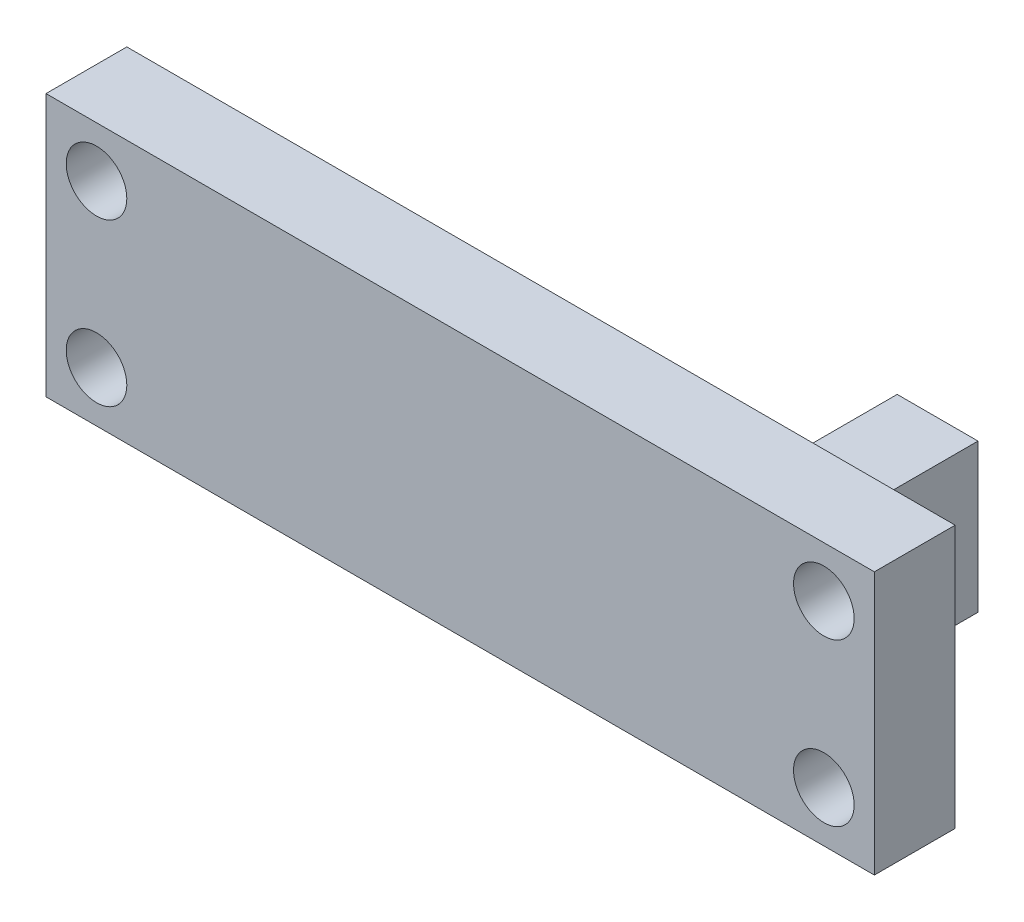
ISO-10303-21;
HEADER;
FILE_DESCRIPTION(('STEP AP214'),'2;1');
FILE_NAME('part.step','',(''),(''),'','','');
FILE_SCHEMA(('AUTOMOTIVE_DESIGN { 1 0 10303 214 1 1 1 1 }'));
ENDSEC;
DATA;
#1=APPLICATION_CONTEXT('core data for automotive mechanical design processes');
#2=APPLICATION_PROTOCOL_DEFINITION('international standard','automotive_design',2000,#1);
#3=PRODUCT_CONTEXT('',#1,'mechanical');
#4=PRODUCT('Part','Part','',(#3));
#5=PRODUCT_RELATED_PRODUCT_CATEGORY('part','',(#4));
#6=PRODUCT_DEFINITION_FORMATION('','',#4);
#7=PRODUCT_DEFINITION_CONTEXT('part definition',#1,'design');
#8=PRODUCT_DEFINITION('design','',#6,#7);
#9=PRODUCT_DEFINITION_SHAPE('','',#8);
#10=(LENGTH_UNIT() NAMED_UNIT(*) SI_UNIT(.MILLI.,.METRE.));
#11=(NAMED_UNIT(*) PLANE_ANGLE_UNIT() SI_UNIT($,.RADIAN.));
#12=(NAMED_UNIT(*) SI_UNIT($,.STERADIAN.) SOLID_ANGLE_UNIT());
#13=UNCERTAINTY_MEASURE_WITH_UNIT(LENGTH_MEASURE(1.E-05),#10,'distance_accuracy_value','');
#14=(GEOMETRIC_REPRESENTATION_CONTEXT(3) GLOBAL_UNCERTAINTY_ASSIGNED_CONTEXT((#13)) GLOBAL_UNIT_ASSIGNED_CONTEXT((#10,
#11,#12)) REPRESENTATION_CONTEXT('',''));
#15=CARTESIAN_POINT('',(0.,0.,0.));
#16=DIRECTION('',(0.,0.,1.));
#17=DIRECTION('',(1.,0.,0.));
#18=AXIS2_PLACEMENT_3D('',#15,#16,#17);
#19=CARTESIAN_POINT('',(0.,0.,0.));
#20=DIRECTION('',(0.,0.,1.));
#21=DIRECTION('',(1.,0.,0.));
#22=AXIS2_PLACEMENT_3D('',#19,#20,#21);
#23=PLANE('',#22);
#24=DIRECTION('',(0.,-1.,0.));
#25=VECTOR('',#24,1.);
#26=CARTESIAN_POINT('',(-41.,13.,0.));
#27=LINE('',#26,#25);
#28=CARTESIAN_POINT('',(-41.,13.,0.));
#29=VERTEX_POINT('',#28);
#30=CARTESIAN_POINT('',(-41.,0.,0.));
#31=VERTEX_POINT('',#30);
#32=EDGE_CURVE('E150',#29,#31,#27,.T.);
#33=ORIENTED_EDGE('',*,*,#32,.F.);
#34=DIRECTION('',(-1.,0.,0.));
#35=VECTOR('',#34,1.);
#36=CARTESIAN_POINT('',(-41.,13.,0.));
#37=LINE('',#36,#35);
#38=CARTESIAN_POINT('',(0.,13.,0.));
#39=VERTEX_POINT('',#38);
#40=EDGE_CURVE('E157',#39,#29,#37,.T.);
#41=ORIENTED_EDGE('',*,*,#40,.F.);
#42=DIRECTION('',(0.,1.,0.));
#43=VECTOR('',#42,1.);
#44=CARTESIAN_POINT('',(0.,13.,0.));
#45=LINE('',#44,#43);
#46=CARTESIAN_POINT('',(0.,0.,0.));
#47=VERTEX_POINT('',#46);
#48=EDGE_CURVE('E168',#47,#39,#45,.T.);
#49=ORIENTED_EDGE('',*,*,#48,.F.);
#50=DIRECTION('',(1.,0.,0.));
#51=VECTOR('',#50,1.);
#52=CARTESIAN_POINT('',(-41.,0.,0.));
#53=LINE('',#52,#51);
#54=EDGE_CURVE('E166',#31,#47,#53,.T.);
#55=ORIENTED_EDGE('',*,*,#54,.F.);
#56=EDGE_LOOP('',(#33,#41,#49,#55));
#57=FACE_BOUND('',#56,.T.);
#58=CARTESIAN_POINT('',(-2.5,10.5,0.));
#59=DIRECTION('',(0.,0.,1.));
#60=DIRECTION('',(1.,0.,0.));
#61=AXIS2_PLACEMENT_3D('',#58,#59,#60);
#62=CIRCLE('',#61,1.5);
#63=CARTESIAN_POINT('',(-1.,10.5,0.));
#64=VERTEX_POINT('',#63);
#65=EDGE_CURVE('E147',#64,#64,#62,.T.);
#66=ORIENTED_EDGE('',*,*,#65,.T.);
#67=EDGE_LOOP('',(#66));
#68=FACE_BOUND('',#67,.T.);
#69=CARTESIAN_POINT('',(-38.5,2.5,0.));
#70=DIRECTION('',(0.,0.,1.));
#71=DIRECTION('',(1.,0.,0.));
#72=AXIS2_PLACEMENT_3D('',#69,#70,#71);
#73=CIRCLE('',#72,1.5);
#74=CARTESIAN_POINT('',(-37.,2.5,0.));
#75=VERTEX_POINT('',#74);
#76=EDGE_CURVE('E126',#75,#75,#73,.T.);
#77=ORIENTED_EDGE('',*,*,#76,.T.);
#78=EDGE_LOOP('',(#77));
#79=FACE_BOUND('',#78,.T.);
#80=CARTESIAN_POINT('',(-38.5,10.5,0.));
#81=DIRECTION('',(0.,0.,1.));
#82=DIRECTION('',(1.,0.,0.));
#83=AXIS2_PLACEMENT_3D('',#80,#81,#82);
#84=CIRCLE('',#83,1.5);
#85=CARTESIAN_POINT('',(-37.,10.5,0.));
#86=VERTEX_POINT('',#85);
#87=EDGE_CURVE('E142',#86,#86,#84,.T.);
#88=ORIENTED_EDGE('',*,*,#87,.T.);
#89=EDGE_LOOP('',(#88));
#90=FACE_BOUND('',#89,.T.);
#91=CARTESIAN_POINT('',(-2.5,2.5,0.));
#92=DIRECTION('',(0.,0.,1.));
#93=DIRECTION('',(1.,0.,0.));
#94=AXIS2_PLACEMENT_3D('',#91,#92,#93);
#95=CIRCLE('',#94,1.5);
#96=CARTESIAN_POINT('',(-1.,2.5,0.));
#97=VERTEX_POINT('',#96);
#98=EDGE_CURVE('E135',#97,#97,#95,.T.);
#99=ORIENTED_EDGE('',*,*,#98,.T.);
#100=EDGE_LOOP('',(#99));
#101=FACE_BOUND('',#100,.T.);
#102=DIRECTION('',(0.,-1.,0.));
#103=VECTOR('',#102,1.);
#104=CARTESIAN_POINT('',(-5.87,10.17,0.));
#105=LINE('',#104,#103);
#106=CARTESIAN_POINT('',(-5.87,10.17,0.));
#107=VERTEX_POINT('',#106);
#108=CARTESIAN_POINT('',(-5.87,2.83,0.));
#109=VERTEX_POINT('',#108);
#110=EDGE_CURVE('E122',#107,#109,#105,.T.);
#111=ORIENTED_EDGE('',*,*,#110,.F.);
#112=DIRECTION('',(1.,0.,0.));
#113=VECTOR('',#112,1.);
#114=CARTESIAN_POINT('',(-5.87,10.17,0.));
#115=LINE('',#114,#113);
#116=CARTESIAN_POINT('',(-9.87,10.17,0.));
#117=VERTEX_POINT('',#116);
#118=EDGE_CURVE('E119',#117,#107,#115,.T.);
#119=ORIENTED_EDGE('',*,*,#118,.F.);
#120=DIRECTION('',(0.,1.,0.));
#121=VECTOR('',#120,1.);
#122=CARTESIAN_POINT('',(-9.87,10.17,0.));
#123=LINE('',#122,#121);
#124=CARTESIAN_POINT('',(-9.87,2.83,0.));
#125=VERTEX_POINT('',#124);
#126=EDGE_CURVE('E57',#125,#117,#123,.T.);
#127=ORIENTED_EDGE('',*,*,#126,.F.);
#128=DIRECTION('',(-1.,0.,0.));
#129=VECTOR('',#128,1.);
#130=CARTESIAN_POINT('',(-5.87,2.83,0.));
#131=LINE('',#130,#129);
#132=EDGE_CURVE('E52',#109,#125,#131,.T.);
#133=ORIENTED_EDGE('',*,*,#132,.F.);
#134=EDGE_LOOP('',(#111,#119,#127,#133));
#135=FACE_BOUND('',#134,.T.);
#136=ADVANCED_FACE('F37',(#57,#68,#79,#90,#101,#135),#23,.F.);
#137=CARTESIAN_POINT('',(-41.,13.,4.));
#138=DIRECTION('',(1.,0.,0.));
#139=DIRECTION('',(0.,1.,0.));
#140=AXIS2_PLACEMENT_3D('',#137,#138,#139);
#141=PLANE('',#140);
#142=ORIENTED_EDGE('',*,*,#32,.T.);
#143=DIRECTION('',(0.,0.,-1.));
#144=VECTOR('',#143,1.);
#145=CARTESIAN_POINT('',(-41.,0.,4.));
#146=LINE('',#145,#144);
#147=CARTESIAN_POINT('',(-41.,0.,4.));
#148=VERTEX_POINT('',#147);
#149=EDGE_CURVE('E11',#148,#31,#146,.T.);
#150=ORIENTED_EDGE('',*,*,#149,.F.);
#151=DIRECTION('',(0.,-1.,0.));
#152=VECTOR('',#151,1.);
#153=CARTESIAN_POINT('',(-41.,13.,4.));
#154=LINE('',#153,#152);
#155=CARTESIAN_POINT('',(-41.,13.,4.));
#156=VERTEX_POINT('',#155);
#157=EDGE_CURVE('E153',#156,#148,#154,.T.);
#158=ORIENTED_EDGE('',*,*,#157,.F.);
#159=DIRECTION('',(0.,0.,-1.));
#160=VECTOR('',#159,1.);
#161=CARTESIAN_POINT('',(-41.,13.,4.));
#162=LINE('',#161,#160);
#163=EDGE_CURVE('E163',#156,#29,#162,.T.);
#164=ORIENTED_EDGE('',*,*,#163,.T.);
#165=EDGE_LOOP('',(#142,#150,#158,#164));
#166=FACE_BOUND('',#165,.T.);
#167=ADVANCED_FACE('F39',(#166),#141,.F.);
#168=CARTESIAN_POINT('',(-41.,0.,4.));
#169=DIRECTION('',(0.,1.,0.));
#170=DIRECTION('',(0.,0.,1.));
#171=AXIS2_PLACEMENT_3D('',#168,#169,#170);
#172=PLANE('',#171);
#173=ORIENTED_EDGE('',*,*,#54,.T.);
#174=DIRECTION('',(0.,0.,-1.));
#175=VECTOR('',#174,1.);
#176=CARTESIAN_POINT('',(0.,0.,4.));
#177=LINE('',#176,#175);
#178=CARTESIAN_POINT('',(0.,0.,4.));
#179=VERTEX_POINT('',#178);
#180=EDGE_CURVE('E45',#179,#47,#177,.T.);
#181=ORIENTED_EDGE('',*,*,#180,.F.);
#182=DIRECTION('',(1.,0.,0.));
#183=VECTOR('',#182,1.);
#184=CARTESIAN_POINT('',(-41.,0.,4.));
#185=LINE('',#184,#183);
#186=EDGE_CURVE('E156',#148,#179,#185,.T.);
#187=ORIENTED_EDGE('',*,*,#186,.F.);
#188=ORIENTED_EDGE('',*,*,#149,.T.);
#189=EDGE_LOOP('',(#173,#181,#187,#188));
#190=FACE_BOUND('',#189,.T.);
#191=ADVANCED_FACE('F196',(#190),#172,.F.);
#192=CARTESIAN_POINT('',(0.,13.,4.));
#193=DIRECTION('',(-1.,0.,0.));
#194=DIRECTION('',(0.,-1.,0.));
#195=AXIS2_PLACEMENT_3D('',#192,#193,#194);
#196=PLANE('',#195);
#197=ORIENTED_EDGE('',*,*,#48,.T.);
#198=DIRECTION('',(0.,0.,-1.));
#199=VECTOR('',#198,1.);
#200=CARTESIAN_POINT('',(0.,13.,4.));
#201=LINE('',#200,#199);
#202=CARTESIAN_POINT('',(0.,13.,4.));
#203=VERTEX_POINT('',#202);
#204=EDGE_CURVE('E173',#203,#39,#201,.T.);
#205=ORIENTED_EDGE('',*,*,#204,.F.);
#206=DIRECTION('',(0.,1.,0.));
#207=VECTOR('',#206,1.);
#208=CARTESIAN_POINT('',(0.,13.,4.));
#209=LINE('',#208,#207);
#210=EDGE_CURVE('E159',#179,#203,#209,.T.);
#211=ORIENTED_EDGE('',*,*,#210,.F.);
#212=ORIENTED_EDGE('',*,*,#180,.T.);
#213=EDGE_LOOP('',(#197,#205,#211,#212));
#214=FACE_BOUND('',#213,.T.);
#215=ADVANCED_FACE('F180',(#214),#196,.F.);
#216=CARTESIAN_POINT('',(-41.,13.,4.));
#217=DIRECTION('',(0.,-1.,0.));
#218=DIRECTION('',(0.,0.,-1.));
#219=AXIS2_PLACEMENT_3D('',#216,#217,#218);
#220=PLANE('',#219);
#221=ORIENTED_EDGE('',*,*,#40,.T.);
#222=ORIENTED_EDGE('',*,*,#163,.F.);
#223=DIRECTION('',(-1.,0.,0.));
#224=VECTOR('',#223,1.);
#225=CARTESIAN_POINT('',(-41.,13.,4.));
#226=LINE('',#225,#224);
#227=EDGE_CURVE('E161',#203,#156,#226,.T.);
#228=ORIENTED_EDGE('',*,*,#227,.F.);
#229=ORIENTED_EDGE('',*,*,#204,.T.);
#230=EDGE_LOOP('',(#221,#222,#228,#229));
#231=FACE_BOUND('',#230,.T.);
#232=ADVANCED_FACE('F189',(#231),#220,.F.);
#233=CARTESIAN_POINT('',(0.,0.,4.));
#234=DIRECTION('',(0.,0.,1.));
#235=DIRECTION('',(1.,0.,0.));
#236=AXIS2_PLACEMENT_3D('',#233,#234,#235);
#237=PLANE('',#236);
#238=CARTESIAN_POINT('',(-2.5,2.5,4.));
#239=DIRECTION('',(0.,0.,1.));
#240=DIRECTION('',(1.,0.,0.));
#241=AXIS2_PLACEMENT_3D('',#238,#239,#240);
#242=CIRCLE('',#241,1.5);
#243=CARTESIAN_POINT('',(-1.,2.5,4.));
#244=VERTEX_POINT('',#243);
#245=EDGE_CURVE('E139',#244,#244,#242,.T.);
#246=ORIENTED_EDGE('',*,*,#245,.F.);
#247=EDGE_LOOP('',(#246));
#248=FACE_BOUND('',#247,.T.);
#249=CARTESIAN_POINT('',(-38.5,10.5,4.));
#250=DIRECTION('',(0.,0.,1.));
#251=DIRECTION('',(1.,0.,0.));
#252=AXIS2_PLACEMENT_3D('',#249,#250,#251);
#253=CIRCLE('',#252,1.5);
#254=CARTESIAN_POINT('',(-37.,10.5,4.));
#255=VERTEX_POINT('',#254);
#256=EDGE_CURVE('E133',#255,#255,#253,.T.);
#257=ORIENTED_EDGE('',*,*,#256,.F.);
#258=EDGE_LOOP('',(#257));
#259=FACE_BOUND('',#258,.T.);
#260=CARTESIAN_POINT('',(-38.5,2.5,4.));
#261=DIRECTION('',(0.,0.,1.));
#262=DIRECTION('',(1.,0.,0.));
#263=AXIS2_PLACEMENT_3D('',#260,#261,#262);
#264=CIRCLE('',#263,1.5);
#265=CARTESIAN_POINT('',(-37.,2.5,4.));
#266=VERTEX_POINT('',#265);
#267=EDGE_CURVE('E123',#266,#266,#264,.T.);
#268=ORIENTED_EDGE('',*,*,#267,.F.);
#269=EDGE_LOOP('',(#268));
#270=FACE_BOUND('',#269,.T.);
#271=CARTESIAN_POINT('',(-2.5,10.5,4.));
#272=DIRECTION('',(0.,0.,1.));
#273=DIRECTION('',(1.,0.,0.));
#274=AXIS2_PLACEMENT_3D('',#271,#272,#273);
#275=CIRCLE('',#274,1.5);
#276=CARTESIAN_POINT('',(-1.,10.5,4.));
#277=VERTEX_POINT('',#276);
#278=EDGE_CURVE('E138',#277,#277,#275,.T.);
#279=ORIENTED_EDGE('',*,*,#278,.F.);
#280=EDGE_LOOP('',(#279));
#281=FACE_BOUND('',#280,.T.);
#282=ORIENTED_EDGE('',*,*,#157,.T.);
#283=ORIENTED_EDGE('',*,*,#186,.T.);
#284=ORIENTED_EDGE('',*,*,#210,.T.);
#285=ORIENTED_EDGE('',*,*,#227,.T.);
#286=EDGE_LOOP('',(#282,#283,#284,#285));
#287=FACE_BOUND('',#286,.T.);
#288=ADVANCED_FACE('F195',(#248,#259,#270,#281,#287),#237,.T.);
#289=CARTESIAN_POINT('',(-2.5,10.5,0.));
#290=DIRECTION('',(0.,0.,1.));
#291=DIRECTION('',(1.,0.,0.));
#292=AXIS2_PLACEMENT_3D('',#289,#290,#291);
#293=CYLINDRICAL_SURFACE('',#292,1.5);
#294=ORIENTED_EDGE('',*,*,#65,.F.);
#295=EDGE_LOOP('',(#294));
#296=FACE_BOUND('',#295,.T.);
#297=ORIENTED_EDGE('',*,*,#278,.T.);
#298=EDGE_LOOP('',(#297));
#299=FACE_BOUND('',#298,.T.);
#300=ADVANCED_FACE('F214',(#296,#299),#293,.F.);
#301=CARTESIAN_POINT('',(-38.5,2.5,0.));
#302=DIRECTION('',(0.,0.,1.));
#303=DIRECTION('',(1.,0.,0.));
#304=AXIS2_PLACEMENT_3D('',#301,#302,#303);
#305=CYLINDRICAL_SURFACE('',#304,1.5);
#306=ORIENTED_EDGE('',*,*,#76,.F.);
#307=EDGE_LOOP('',(#306));
#308=FACE_BOUND('',#307,.T.);
#309=ORIENTED_EDGE('',*,*,#267,.T.);
#310=EDGE_LOOP('',(#309));
#311=FACE_BOUND('',#310,.T.);
#312=ADVANCED_FACE('F219',(#308,#311),#305,.F.);
#313=CARTESIAN_POINT('',(-38.5,10.5,0.));
#314=DIRECTION('',(0.,0.,1.));
#315=DIRECTION('',(1.,0.,0.));
#316=AXIS2_PLACEMENT_3D('',#313,#314,#315);
#317=CYLINDRICAL_SURFACE('',#316,1.5);
#318=ORIENTED_EDGE('',*,*,#87,.F.);
#319=EDGE_LOOP('',(#318));
#320=FACE_BOUND('',#319,.T.);
#321=ORIENTED_EDGE('',*,*,#256,.T.);
#322=EDGE_LOOP('',(#321));
#323=FACE_BOUND('',#322,.T.);
#324=ADVANCED_FACE('F231',(#320,#323),#317,.F.);
#325=CARTESIAN_POINT('',(-2.5,2.5,0.));
#326=DIRECTION('',(0.,0.,1.));
#327=DIRECTION('',(1.,0.,0.));
#328=AXIS2_PLACEMENT_3D('',#325,#326,#327);
#329=CYLINDRICAL_SURFACE('',#328,1.5);
#330=ORIENTED_EDGE('',*,*,#98,.F.);
#331=EDGE_LOOP('',(#330));
#332=FACE_BOUND('',#331,.T.);
#333=ORIENTED_EDGE('',*,*,#245,.T.);
#334=EDGE_LOOP('',(#333));
#335=FACE_BOUND('',#334,.T.);
#336=ADVANCED_FACE('F237',(#332,#335),#329,.F.);
#337=CARTESIAN_POINT('',(-5.87,10.17,-7.));
#338=DIRECTION('',(-1.,0.,0.));
#339=DIRECTION('',(0.,-1.,0.));
#340=AXIS2_PLACEMENT_3D('',#337,#338,#339);
#341=PLANE('',#340);
#342=ORIENTED_EDGE('',*,*,#110,.T.);
#343=DIRECTION('',(0.,0.,1.));
#344=VECTOR('',#343,1.);
#345=CARTESIAN_POINT('',(-5.87,2.83,-7.));
#346=LINE('',#345,#344);
#347=CARTESIAN_POINT('',(-5.87,2.83,-7.));
#348=VERTEX_POINT('',#347);
#349=EDGE_CURVE('E103',#348,#109,#346,.T.);
#350=ORIENTED_EDGE('',*,*,#349,.F.);
#351=DIRECTION('',(0.,-1.,0.));
#352=VECTOR('',#351,1.);
#353=CARTESIAN_POINT('',(-5.87,10.17,-7.));
#354=LINE('',#353,#352);
#355=CARTESIAN_POINT('',(-5.87,10.17,-7.));
#356=VERTEX_POINT('',#355);
#357=EDGE_CURVE('E110',#356,#348,#354,.T.);
#358=ORIENTED_EDGE('',*,*,#357,.F.);
#359=DIRECTION('',(0.,0.,1.));
#360=VECTOR('',#359,1.);
#361=CARTESIAN_POINT('',(-5.87,10.17,-7.));
#362=LINE('',#361,#360);
#363=EDGE_CURVE('E257',#356,#107,#362,.T.);
#364=ORIENTED_EDGE('',*,*,#363,.T.);
#365=EDGE_LOOP('',(#342,#350,#358,#364));
#366=FACE_BOUND('',#365,.T.);
#367=ADVANCED_FACE('F121',(#366),#341,.F.);
#368=CARTESIAN_POINT('',(-5.87,2.83,-7.));
#369=DIRECTION('',(0.,1.,0.));
#370=DIRECTION('',(-1.,0.,0.));
#371=AXIS2_PLACEMENT_3D('',#368,#369,#370);
#372=PLANE('',#371);
#373=ORIENTED_EDGE('',*,*,#132,.T.);
#374=DIRECTION('',(0.,0.,1.));
#375=VECTOR('',#374,1.);
#376=CARTESIAN_POINT('',(-9.87,2.83,-7.));
#377=LINE('',#376,#375);
#378=CARTESIAN_POINT('',(-9.87,2.83,-7.));
#379=VERTEX_POINT('',#378);
#380=EDGE_CURVE('E106',#379,#125,#377,.T.);
#381=ORIENTED_EDGE('',*,*,#380,.F.);
#382=DIRECTION('',(-1.,0.,0.));
#383=VECTOR('',#382,1.);
#384=CARTESIAN_POINT('',(-5.87,2.83,-7.));
#385=LINE('',#384,#383);
#386=EDGE_CURVE('E99',#348,#379,#385,.T.);
#387=ORIENTED_EDGE('',*,*,#386,.F.);
#388=ORIENTED_EDGE('',*,*,#349,.T.);
#389=EDGE_LOOP('',(#373,#381,#387,#388));
#390=FACE_BOUND('',#389,.T.);
#391=ADVANCED_FACE('F101',(#390),#372,.F.);
#392=CARTESIAN_POINT('',(-9.87,10.17,-7.));
#393=DIRECTION('',(1.,0.,0.));
#394=DIRECTION('',(0.,1.,0.));
#395=AXIS2_PLACEMENT_3D('',#392,#393,#394);
#396=PLANE('',#395);
#397=ORIENTED_EDGE('',*,*,#126,.T.);
#398=DIRECTION('',(0.,0.,1.));
#399=VECTOR('',#398,1.);
#400=CARTESIAN_POINT('',(-9.87,10.17,-7.));
#401=LINE('',#400,#399);
#402=CARTESIAN_POINT('',(-9.87,10.17,-7.));
#403=VERTEX_POINT('',#402);
#404=EDGE_CURVE('E128',#403,#117,#401,.T.);
#405=ORIENTED_EDGE('',*,*,#404,.F.);
#406=DIRECTION('',(0.,1.,0.));
#407=VECTOR('',#406,1.);
#408=CARTESIAN_POINT('',(-9.87,10.17,-7.));
#409=LINE('',#408,#407);
#410=EDGE_CURVE('E109',#379,#403,#409,.T.);
#411=ORIENTED_EDGE('',*,*,#410,.F.);
#412=ORIENTED_EDGE('',*,*,#380,.T.);
#413=EDGE_LOOP('',(#397,#405,#411,#412));
#414=FACE_BOUND('',#413,.T.);
#415=ADVANCED_FACE('F266',(#414),#396,.F.);
#416=CARTESIAN_POINT('',(-5.87,10.17,-7.));
#417=DIRECTION('',(0.,-1.,0.));
#418=DIRECTION('',(1.,0.,0.));
#419=AXIS2_PLACEMENT_3D('',#416,#417,#418);
#420=PLANE('',#419);
#421=ORIENTED_EDGE('',*,*,#118,.T.);
#422=ORIENTED_EDGE('',*,*,#363,.F.);
#423=DIRECTION('',(1.,0.,0.));
#424=VECTOR('',#423,1.);
#425=CARTESIAN_POINT('',(-5.87,10.17,-7.));
#426=LINE('',#425,#424);
#427=EDGE_CURVE('E115',#403,#356,#426,.T.);
#428=ORIENTED_EDGE('',*,*,#427,.F.);
#429=ORIENTED_EDGE('',*,*,#404,.T.);
#430=EDGE_LOOP('',(#421,#422,#428,#429));
#431=FACE_BOUND('',#430,.T.);
#432=ADVANCED_FACE('F256',(#431),#420,.F.);
#433=CARTESIAN_POINT('',(0.,0.,-7.));
#434=DIRECTION('',(0.,0.,-1.));
#435=DIRECTION('',(-1.,0.,0.));
#436=AXIS2_PLACEMENT_3D('',#433,#434,#435);
#437=PLANE('',#436);
#438=ORIENTED_EDGE('',*,*,#357,.T.);
#439=ORIENTED_EDGE('',*,*,#386,.T.);
#440=ORIENTED_EDGE('',*,*,#410,.T.);
#441=ORIENTED_EDGE('',*,*,#427,.T.);
#442=EDGE_LOOP('',(#438,#439,#440,#441));
#443=FACE_BOUND('',#442,.T.);
#444=ADVANCED_FACE('F113',(#443),#437,.T.);
#445=CLOSED_SHELL('',(#136,#167,#191,#215,#232,#288,#300,#312,#324,#336,#367,#391,#415,#432,#444));
#446=MANIFOLD_SOLID_BREP('B2',#445);
#447=ADVANCED_BREP_SHAPE_REPRESENTATION('',(#18,#446),#14);
#448=SHAPE_DEFINITION_REPRESENTATION(#9,#447);
ENDSEC;
END-ISO-10303-21;
